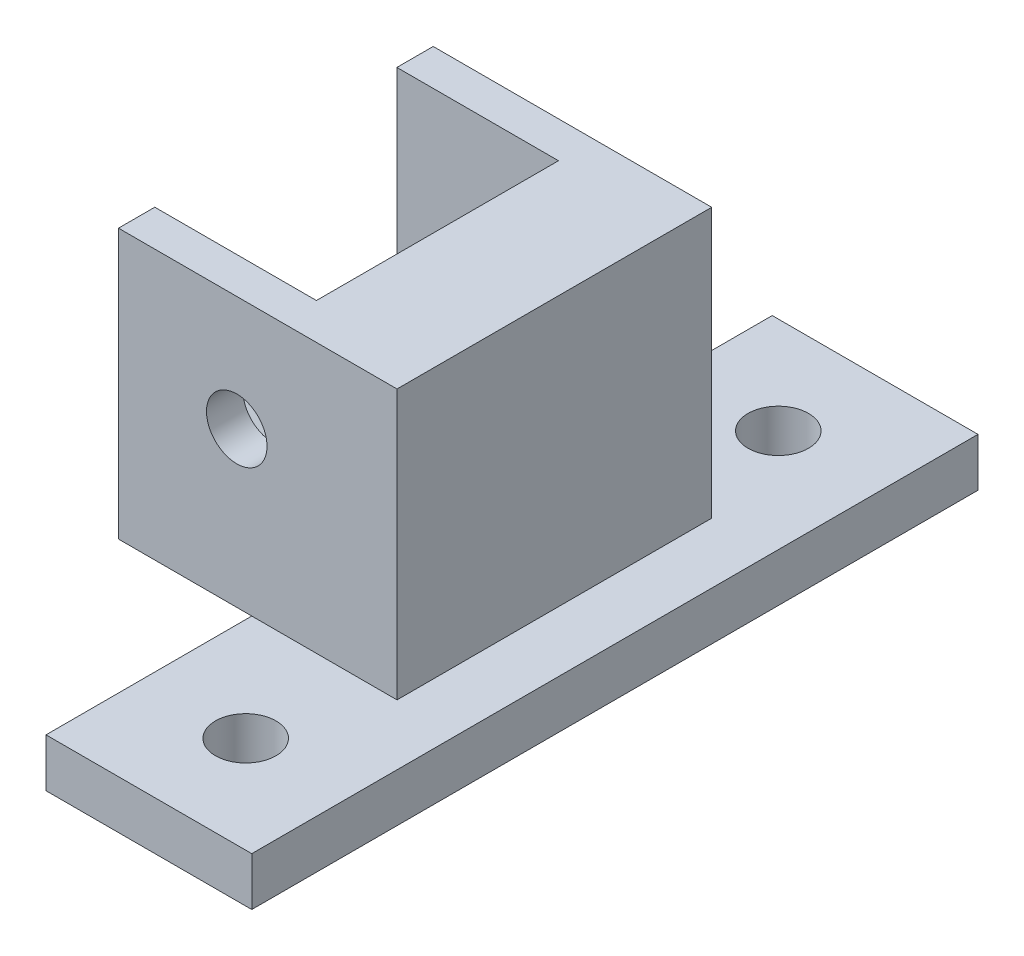
ISO-10303-21;
HEADER;
FILE_DESCRIPTION(('STEP AP214'),'2;1');
FILE_NAME('part.step','',(''),(''),'','','');
FILE_SCHEMA(('AUTOMOTIVE_DESIGN { 1 0 10303 214 1 1 1 1 }'));
ENDSEC;
DATA;
#1=APPLICATION_CONTEXT('core data for automotive mechanical design processes');
#2=APPLICATION_PROTOCOL_DEFINITION('international standard','automotive_design',2000,#1);
#3=PRODUCT_CONTEXT('',#1,'mechanical');
#4=PRODUCT('Part','Part','',(#3));
#5=PRODUCT_RELATED_PRODUCT_CATEGORY('part','',(#4));
#6=PRODUCT_DEFINITION_FORMATION('','',#4);
#7=PRODUCT_DEFINITION_CONTEXT('part definition',#1,'design');
#8=PRODUCT_DEFINITION('design','',#6,#7);
#9=PRODUCT_DEFINITION_SHAPE('','',#8);
#10=(LENGTH_UNIT() NAMED_UNIT(*) SI_UNIT(.MILLI.,.METRE.));
#11=(NAMED_UNIT(*) PLANE_ANGLE_UNIT() SI_UNIT($,.RADIAN.));
#12=(NAMED_UNIT(*) SI_UNIT($,.STERADIAN.) SOLID_ANGLE_UNIT());
#13=UNCERTAINTY_MEASURE_WITH_UNIT(LENGTH_MEASURE(1.E-05),#10,'distance_accuracy_value','');
#14=(GEOMETRIC_REPRESENTATION_CONTEXT(3) GLOBAL_UNCERTAINTY_ASSIGNED_CONTEXT((#13)) GLOBAL_UNIT_ASSIGNED_CONTEXT((#10,
#11,#12)) REPRESENTATION_CONTEXT('',''));
#15=CARTESIAN_POINT('',(0.,0.,0.));
#16=DIRECTION('',(0.,0.,1.));
#17=DIRECTION('',(1.,0.,0.));
#18=AXIS2_PLACEMENT_3D('',#15,#16,#17);
#19=CARTESIAN_POINT('',(0.,323.779975182462,-29.21));
#20=DIRECTION('',(0.,-1.,0.));
#21=DIRECTION('',(0.,0.,-1.));
#22=AXIS2_PLACEMENT_3D('',#19,#20,#21);
#23=PLANE('',#22);
#24=DIRECTION('',(1.,0.,0.));
#25=VECTOR('',#24,1.);
#26=CARTESIAN_POINT('',(0.,323.779975182462,-29.21));
#27=LINE('',#26,#25);
#28=CARTESIAN_POINT('',(497.23394626751,323.779975182462,-29.21));
#29=VERTEX_POINT('',#28);
#30=CARTESIAN_POINT('',(511.217560082314,323.779975182462,-29.21));
#31=VERTEX_POINT('',#30);
#32=EDGE_CURVE('E162',#29,#31,#27,.T.);
#33=ORIENTED_EDGE('',*,*,#32,.T.);
#34=DIRECTION('',(0.,0.,1.));
#35=VECTOR('',#34,1.);
#36=CARTESIAN_POINT('',(511.217560082314,323.779975182462,-50.8));
#37=LINE('',#36,#35);
#38=CARTESIAN_POINT('',(511.217560082314,323.779975182462,3.81));
#39=VERTEX_POINT('',#38);
#40=EDGE_CURVE('E12',#31,#39,#37,.T.);
#41=ORIENTED_EDGE('',*,*,#40,.T.);
#42=DIRECTION('',(-1.,0.,0.));
#43=VECTOR('',#42,1.);
#44=CARTESIAN_POINT('',(526.457560082314,323.779975182462,3.81));
#45=LINE('',#44,#43);
#46=CARTESIAN_POINT('',(497.23394626751,323.779975182462,3.81));
#47=VERTEX_POINT('',#46);
#48=EDGE_CURVE('E224',#39,#47,#45,.T.);
#49=ORIENTED_EDGE('',*,*,#48,.T.);
#50=DIRECTION('',(0.,0.,1.));
#51=VECTOR('',#50,1.);
#52=CARTESIAN_POINT('',(497.23394626751,323.779975182462,-29.21));
#53=LINE('',#52,#51);
#54=EDGE_CURVE('E194',#29,#47,#53,.T.);
#55=ORIENTED_EDGE('',*,*,#54,.F.);
#56=EDGE_LOOP('',(#33,#41,#49,#55));
#57=FACE_BOUND('',#56,.T.);
#58=ADVANCED_FACE('F62',(#57),#23,.T.);
#59=CARTESIAN_POINT('',(509.64503003972,340.,-29.21));
#60=DIRECTION('',(0.,0.,1.));
#61=DIRECTION('',(1.,0.,0.));
#62=AXIS2_PLACEMENT_3D('',#59,#60,#61);
#63=CYLINDRICAL_SURFACE('',#62,12.7);
#64=DIRECTION('',(0.,0.,1.));
#65=VECTOR('',#64,1.);
#66=CARTESIAN_POINT('',(515.974168529679,351.010540675867,-29.21));
#67=LINE('',#66,#65);
#68=CARTESIAN_POINT('',(515.974168529679,351.010540675867,-25.3999999999999));
#69=VERTEX_POINT('',#68);
#70=CARTESIAN_POINT('',(515.974168529679,351.010540675867,0.));
#71=VERTEX_POINT('',#70);
#72=EDGE_CURVE('E72',#69,#71,#67,.T.);
#73=ORIENTED_EDGE('',*,*,#72,.F.);
#74=CARTESIAN_POINT('',(509.64503003972,340.,-25.3999999999999));
#75=DIRECTION('',(0.,0.,-1.));
#76=DIRECTION('',(1.,0.,0.));
#77=AXIS2_PLACEMENT_3D('',#74,#75,#76);
#78=CIRCLE('',#77,12.6999999999999);
#79=CARTESIAN_POINT('',(503.315891549762,328.989459324133,-25.3999999999999));
#80=VERTEX_POINT('',#79);
#81=EDGE_CURVE('E207',#69,#80,#78,.T.);
#82=ORIENTED_EDGE('',*,*,#81,.T.);
#83=DIRECTION('',(0.,0.,1.));
#84=VECTOR('',#83,1.);
#85=CARTESIAN_POINT('',(503.315891549762,328.989459324133,-29.21));
#86=LINE('',#85,#84);
#87=CARTESIAN_POINT('',(503.315891549762,328.989459324133,0.));
#88=VERTEX_POINT('',#87);
#89=EDGE_CURVE('E66',#80,#88,#86,.T.);
#90=ORIENTED_EDGE('',*,*,#89,.T.);
#91=CARTESIAN_POINT('',(509.64503003972,340.,0.));
#92=DIRECTION('',(0.,0.,1.));
#93=DIRECTION('',(1.,0.,0.));
#94=AXIS2_PLACEMENT_3D('',#91,#92,#93);
#95=CIRCLE('',#94,12.7);
#96=EDGE_CURVE('E146',#88,#71,#95,.T.);
#97=ORIENTED_EDGE('',*,*,#96,.T.);
#98=EDGE_LOOP('',(#73,#82,#90,#97));
#99=FACE_BOUND('',#98,.T.);
#100=ADVANCED_FACE('F64',(#99),#63,.F.);
#101=CARTESIAN_POINT('',(279.805597512719,486.766234873348,-29.21));
#102=DIRECTION('',(0.498357361414059,0.866971706761194,0.));
#103=DIRECTION('',(-0.866971706761194,0.498357361414059,0.));
#104=AXIS2_PLACEMENT_3D('',#101,#102,#103);
#105=PLANE('',#104);
#106=DIRECTION('',(0.,0.,1.));
#107=VECTOR('',#106,1.);
#108=CARTESIAN_POINT('',(514.192184349642,352.034870451705,-29.21));
#109=LINE('',#108,#107);
#110=CARTESIAN_POINT('',(514.192184349642,352.034870451705,-25.3999999999999));
#111=VERTEX_POINT('',#110);
#112=CARTESIAN_POINT('',(514.192184349642,352.034870451705,0.));
#113=VERTEX_POINT('',#112);
#114=EDGE_CURVE('E185',#111,#113,#109,.T.);
#115=ORIENTED_EDGE('',*,*,#114,.F.);
#116=DIRECTION('',(0.866971706761216,-0.49835736141402,0.));
#117=VECTOR('',#116,1.);
#118=CARTESIAN_POINT('',(515.974168529679,351.010540675867,-25.3999999999999));
#119=LINE('',#118,#117);
#120=EDGE_CURVE('E151',#111,#69,#119,.T.);
#121=ORIENTED_EDGE('',*,*,#120,.T.);
#122=ORIENTED_EDGE('',*,*,#72,.T.);
#123=DIRECTION('',(-0.866971706761194,0.498357361414059,0.));
#124=VECTOR('',#123,1.);
#125=CARTESIAN_POINT('',(279.805597512719,486.766234873348,0.));
#126=LINE('',#125,#124);
#127=EDGE_CURVE('E161',#71,#113,#126,.T.);
#128=ORIENTED_EDGE('',*,*,#127,.T.);
#129=EDGE_LOOP('',(#115,#121,#122,#128));
#130=FACE_BOUND('',#129,.T.);
#131=ADVANCED_FACE('F248',(#130),#105,.F.);
#132=CARTESIAN_POINT('',(0.,352.034870451705,-29.21));
#133=DIRECTION('',(0.,1.,0.));
#134=DIRECTION('',(0.,0.,1.));
#135=AXIS2_PLACEMENT_3D('',#132,#133,#134);
#136=PLANE('',#135);
#137=ORIENTED_EDGE('',*,*,#114,.T.);
#138=DIRECTION('',(1.,0.,0.));
#139=VECTOR('',#138,1.);
#140=CARTESIAN_POINT('',(497.23394626751,352.034870451705,0.));
#141=LINE('',#140,#139);
#142=CARTESIAN_POINT('',(497.23394626751,352.034870451705,0.));
#143=VERTEX_POINT('',#142);
#144=EDGE_CURVE('E102',#143,#113,#141,.T.);
#145=ORIENTED_EDGE('',*,*,#144,.F.);
#146=DIRECTION('',(0.,0.,-1.));
#147=VECTOR('',#146,1.);
#148=CARTESIAN_POINT('',(497.23394626751,352.034870451705,3.81));
#149=LINE('',#148,#147);
#150=CARTESIAN_POINT('',(497.23394626751,352.034870451705,3.81));
#151=VERTEX_POINT('',#150);
#152=EDGE_CURVE('E218',#151,#143,#149,.T.);
#153=ORIENTED_EDGE('',*,*,#152,.F.);
#154=DIRECTION('',(1.,0.,0.));
#155=VECTOR('',#154,1.);
#156=CARTESIAN_POINT('',(497.23394626751,352.034870451705,3.81));
#157=LINE('',#156,#155);
#158=CARTESIAN_POINT('',(526.457560082314,352.034870451705,3.81));
#159=VERTEX_POINT('',#158);
#160=EDGE_CURVE('E352',#151,#159,#157,.T.);
#161=ORIENTED_EDGE('',*,*,#160,.T.);
#162=DIRECTION('',(0.,0.,1.));
#163=VECTOR('',#162,1.);
#164=CARTESIAN_POINT('',(526.457560082314,352.034870451705,-29.21));
#165=LINE('',#164,#163);
#166=CARTESIAN_POINT('',(526.457560082314,352.034870451705,-29.21));
#167=VERTEX_POINT('',#166);
#168=EDGE_CURVE('E90',#167,#159,#165,.T.);
#169=ORIENTED_EDGE('',*,*,#168,.F.);
#170=DIRECTION('',(-1.,0.,0.));
#171=VECTOR('',#170,1.);
#172=CARTESIAN_POINT('',(0.,352.034870451705,-29.21));
#173=LINE('',#172,#171);
#174=CARTESIAN_POINT('',(497.23394626751,352.034870451705,-29.2099999999999));
#175=VERTEX_POINT('',#174);
#176=EDGE_CURVE('E107',#167,#175,#173,.T.);
#177=ORIENTED_EDGE('',*,*,#176,.T.);
#178=DIRECTION('',(0.,0.,1.));
#179=VECTOR('',#178,1.);
#180=CARTESIAN_POINT('',(497.23394626751,352.034870451705,-29.2099999999999));
#181=LINE('',#180,#179);
#182=CARTESIAN_POINT('',(497.23394626751,352.034870451705,-25.3999999999999));
#183=VERTEX_POINT('',#182);
#184=EDGE_CURVE('E132',#175,#183,#181,.T.);
#185=ORIENTED_EDGE('',*,*,#184,.T.);
#186=DIRECTION('',(1.,0.,0.));
#187=VECTOR('',#186,1.);
#188=CARTESIAN_POINT('',(514.192184349642,352.034870451705,-25.3999999999999));
#189=LINE('',#188,#187);
#190=EDGE_CURVE('E140',#183,#111,#189,.T.);
#191=ORIENTED_EDGE('',*,*,#190,.T.);
#192=EDGE_LOOP('',(#137,#145,#153,#161,#169,#177,#185,#191));
#193=FACE_BOUND('',#192,.T.);
#194=ADVANCED_FACE('F143',(#193),#136,.T.);
#195=CARTESIAN_POINT('',(526.457560082314,0.,-29.21));
#196=DIRECTION('',(1.,0.,0.));
#197=DIRECTION('',(0.,0.,-1.));
#198=AXIS2_PLACEMENT_3D('',#195,#196,#197);
#199=PLANE('',#198);
#200=ORIENTED_EDGE('',*,*,#168,.T.);
#201=DIRECTION('',(0.,-1.,0.));
#202=VECTOR('',#201,1.);
#203=CARTESIAN_POINT('',(526.457560082314,352.034870451705,3.81));
#204=LINE('',#203,#202);
#205=CARTESIAN_POINT('',(526.457560082314,323.779975182462,3.81));
#206=VERTEX_POINT('',#205);
#207=EDGE_CURVE('E230',#159,#206,#204,.T.);
#208=ORIENTED_EDGE('',*,*,#207,.T.);
#209=DIRECTION('',(0.,0.,1.));
#210=VECTOR('',#209,1.);
#211=CARTESIAN_POINT('',(526.457560082314,323.779975182462,-29.21));
#212=LINE('',#211,#210);
#213=CARTESIAN_POINT('',(526.457560082314,323.779975182462,-29.21));
#214=VERTEX_POINT('',#213);
#215=EDGE_CURVE('E190',#214,#206,#212,.T.);
#216=ORIENTED_EDGE('',*,*,#215,.F.);
#217=DIRECTION('',(0.,1.,0.));
#218=VECTOR('',#217,1.);
#219=CARTESIAN_POINT('',(526.457560082314,0.,-29.21));
#220=LINE('',#219,#218);
#221=EDGE_CURVE('E166',#214,#167,#220,.T.);
#222=ORIENTED_EDGE('',*,*,#221,.T.);
#223=EDGE_LOOP('',(#200,#208,#216,#222));
#224=FACE_BOUND('',#223,.T.);
#225=ADVANCED_FACE('F359',(#224),#199,.T.);
#226=CARTESIAN_POINT('',(497.233946267508,-1.95378737210305E-12,-29.21));
#227=DIRECTION('',(-1.,0.,0.));
#228=DIRECTION('',(0.,-1.,0.));
#229=AXIS2_PLACEMENT_3D('',#226,#227,#228);
#230=PLANE('',#229);
#231=ORIENTED_EDGE('',*,*,#54,.T.);
#232=DIRECTION('',(0.,1.,0.));
#233=VECTOR('',#232,1.);
#234=CARTESIAN_POINT('',(497.23394626751,323.779975182462,3.81));
#235=LINE('',#234,#233);
#236=EDGE_CURVE('E350',#47,#151,#235,.T.);
#237=ORIENTED_EDGE('',*,*,#236,.T.);
#238=ORIENTED_EDGE('',*,*,#152,.T.);
#239=DIRECTION('',(0.,1.,0.));
#240=VECTOR('',#239,1.);
#241=CARTESIAN_POINT('',(497.23394626751,323.779975182462,0.));
#242=LINE('',#241,#240);
#243=CARTESIAN_POINT('',(497.23394626751,332.485515976836,0.));
#244=VERTEX_POINT('',#243);
#245=EDGE_CURVE('E212',#244,#143,#242,.T.);
#246=ORIENTED_EDGE('',*,*,#245,.F.);
#247=DIRECTION('',(0.,0.,1.));
#248=VECTOR('',#247,1.);
#249=CARTESIAN_POINT('',(497.23394626751,332.485515976836,-29.21));
#250=LINE('',#249,#248);
#251=CARTESIAN_POINT('',(497.23394626751,332.485515976836,-25.3999999999999));
#252=VERTEX_POINT('',#251);
#253=EDGE_CURVE('E135',#252,#244,#250,.T.);
#254=ORIENTED_EDGE('',*,*,#253,.F.);
#255=DIRECTION('',(0.,1.,0.));
#256=VECTOR('',#255,1.);
#257=CARTESIAN_POINT('',(497.23394626751,352.034870451705,-25.3999999999999));
#258=LINE('',#257,#256);
#259=EDGE_CURVE('E128',#252,#183,#258,.T.);
#260=ORIENTED_EDGE('',*,*,#259,.T.);
#261=ORIENTED_EDGE('',*,*,#184,.F.);
#262=DIRECTION('',(0.,-1.,0.));
#263=VECTOR('',#262,1.);
#264=CARTESIAN_POINT('',(497.233946267508,-1.95378737210305E-12,-29.21));
#265=LINE('',#264,#263);
#266=EDGE_CURVE('E157',#175,#29,#265,.T.);
#267=ORIENTED_EDGE('',*,*,#266,.T.);
#268=EDGE_LOOP('',(#231,#237,#238,#246,#254,#260,#261,#267));
#269=FACE_BOUND('',#268,.T.);
#270=ADVANCED_FACE('F130',(#269),#230,.T.);
#271=CARTESIAN_POINT('',(267.147320532804,464.745153521614,-29.21));
#272=DIRECTION('',(-0.498357361414062,-0.866971706761192,0.));
#273=DIRECTION('',(0.866971706761192,-0.498357361414062,0.));
#274=AXIS2_PLACEMENT_3D('',#271,#272,#273);
#275=PLANE('',#274);
#276=ORIENTED_EDGE('',*,*,#89,.F.);
#277=DIRECTION('',(-0.866971706761192,0.498357361414061,0.));
#278=VECTOR('',#277,1.);
#279=CARTESIAN_POINT('',(497.23394626751,332.485515976836,-25.3999999999999));
#280=LINE('',#279,#278);
#281=EDGE_CURVE('E141',#80,#252,#280,.T.);
#282=ORIENTED_EDGE('',*,*,#281,.T.);
#283=ORIENTED_EDGE('',*,*,#253,.T.);
#284=DIRECTION('',(0.866971706761192,-0.498357361414062,0.));
#285=VECTOR('',#284,1.);
#286=CARTESIAN_POINT('',(267.147320532804,464.745153521614,0.));
#287=LINE('',#286,#285);
#288=EDGE_CURVE('E175',#244,#88,#287,.T.);
#289=ORIENTED_EDGE('',*,*,#288,.T.);
#290=EDGE_LOOP('',(#276,#282,#283,#289));
#291=FACE_BOUND('',#290,.T.);
#292=ADVANCED_FACE('F209',(#291),#275,.F.);
#293=CARTESIAN_POINT('',(0.,0.,-29.21));
#294=DIRECTION('',(0.,0.,1.));
#295=DIRECTION('',(1.,0.,0.));
#296=AXIS2_PLACEMENT_3D('',#293,#294,#295);
#297=PLANE('',#296);
#298=ORIENTED_EDGE('',*,*,#266,.F.);
#299=ORIENTED_EDGE('',*,*,#176,.F.);
#300=ORIENTED_EDGE('',*,*,#221,.F.);
#301=EDGE_CURVE('E160',#31,#214,#27,.T.);
#302=ORIENTED_EDGE('',*,*,#301,.F.);
#303=ORIENTED_EDGE('',*,*,#32,.F.);
#304=EDGE_LOOP('',(#298,#299,#300,#302,#303));
#305=FACE_BOUND('',#304,.T.);
#306=CARTESIAN_POINT('',(509.64503003972,340.,-29.2099999999999));
#307=DIRECTION('',(0.,0.,-1.));
#308=DIRECTION('',(-1.,0.,0.));
#309=AXIS2_PLACEMENT_3D('',#306,#307,#308);
#310=CIRCLE('',#309,3.1750000000002);
#311=CARTESIAN_POINT('',(512.82003003972,340.,-29.2099999999999));
#312=VERTEX_POINT('',#311);
#313=EDGE_CURVE('E236',#312,#312,#310,.T.);
#314=ORIENTED_EDGE('',*,*,#313,.F.);
#315=EDGE_LOOP('',(#314));
#316=FACE_BOUND('',#315,.T.);
#317=ADVANCED_FACE('F374',(#305,#316),#297,.F.);
#318=CARTESIAN_POINT('',(509.64503003972,340.,-25.3999999999999));
#319=DIRECTION('',(0.,0.,1.));
#320=DIRECTION('',(1.,0.,0.));
#321=AXIS2_PLACEMENT_3D('',#318,#319,#320);
#322=PLANE('',#321);
#323=ORIENTED_EDGE('',*,*,#120,.F.);
#324=ORIENTED_EDGE('',*,*,#190,.F.);
#325=ORIENTED_EDGE('',*,*,#259,.F.);
#326=ORIENTED_EDGE('',*,*,#281,.F.);
#327=ORIENTED_EDGE('',*,*,#81,.F.);
#328=EDGE_LOOP('',(#323,#324,#325,#326,#327));
#329=FACE_BOUND('',#328,.T.);
#330=CARTESIAN_POINT('',(509.64503003972,340.,-25.3999999999999));
#331=DIRECTION('',(0.,0.,-1.));
#332=DIRECTION('',(-1.,0.,0.));
#333=AXIS2_PLACEMENT_3D('',#330,#331,#332);
#334=CIRCLE('',#333,3.1750000000002);
#335=CARTESIAN_POINT('',(512.82003003972,340.,-25.3999999999999));
#336=VERTEX_POINT('',#335);
#337=EDGE_CURVE('E235',#336,#336,#334,.T.);
#338=ORIENTED_EDGE('',*,*,#337,.T.);
#339=EDGE_LOOP('',(#338));
#340=FACE_BOUND('',#339,.T.);
#341=ADVANCED_FACE('F148',(#329,#340),#322,.T.);
#342=CARTESIAN_POINT('',(509.64503003972,340.,-29.2099999999999));
#343=DIRECTION('',(0.,0.,1.));
#344=DIRECTION('',(1.,0.,0.));
#345=AXIS2_PLACEMENT_3D('',#342,#343,#344);
#346=CYLINDRICAL_SURFACE('',#345,3.1750000000002);
#347=CARTESIAN_POINT('',(512.82003003972,340.,-29.2099999999999));
#348=CARTESIAN_POINT('',(512.82003003972,340.,-29.1703124999999));
#349=CARTESIAN_POINT('',(512.82003003972,340.,-29.1306249999999));
#350=CARTESIAN_POINT('',(512.82003003972,340.,-29.0512499999999));
#351=CARTESIAN_POINT('',(512.82003003972,340.,-29.0115624999999));
#352=CARTESIAN_POINT('',(512.82003003972,340.,-28.9321874999999));
#353=CARTESIAN_POINT('',(512.82003003972,340.,-28.8924999999999));
#354=CARTESIAN_POINT('',(512.82003003972,340.,-28.8131249999999));
#355=CARTESIAN_POINT('',(512.82003003972,340.,-28.7734374999999));
#356=CARTESIAN_POINT('',(512.82003003972,340.,-28.6940624999999));
#357=CARTESIAN_POINT('',(512.82003003972,340.,-28.6543749999999));
#358=CARTESIAN_POINT('',(512.82003003972,340.,-28.5749999999999));
#359=CARTESIAN_POINT('',(512.82003003972,340.,-28.5353124999999));
#360=CARTESIAN_POINT('',(512.82003003972,340.,-28.4559374999999));
#361=CARTESIAN_POINT('',(512.82003003972,340.,-28.4162499999999));
#362=CARTESIAN_POINT('',(512.82003003972,340.,-28.3368749999999));
#363=CARTESIAN_POINT('',(512.82003003972,340.,-28.2971874999999));
#364=CARTESIAN_POINT('',(512.82003003972,340.,-28.2178124999999));
#365=CARTESIAN_POINT('',(512.82003003972,340.,-28.1781249999999));
#366=CARTESIAN_POINT('',(512.82003003972,340.,-28.0987499999999));
#367=CARTESIAN_POINT('',(512.82003003972,340.,-28.0590624999999));
#368=CARTESIAN_POINT('',(512.82003003972,340.,-27.9796874999999));
#369=CARTESIAN_POINT('',(512.82003003972,340.,-27.9399999999999));
#370=CARTESIAN_POINT('',(512.82003003972,340.,-27.8606249999999));
#371=CARTESIAN_POINT('',(512.82003003972,340.,-27.8209374999999));
#372=CARTESIAN_POINT('',(512.82003003972,340.,-27.7415624999999));
#373=CARTESIAN_POINT('',(512.82003003972,340.,-27.7018749999999));
#374=CARTESIAN_POINT('',(512.82003003972,340.,-27.6224999999999));
#375=CARTESIAN_POINT('',(512.82003003972,340.,-27.5828124999999));
#376=CARTESIAN_POINT('',(512.82003003972,340.,-27.5034374999999));
#377=CARTESIAN_POINT('',(512.82003003972,340.,-27.4637499999999));
#378=CARTESIAN_POINT('',(512.82003003972,340.,-27.3843749999999));
#379=CARTESIAN_POINT('',(512.82003003972,340.,-27.3446874999999));
#380=CARTESIAN_POINT('',(512.82003003972,340.,-27.2653124999999));
#381=CARTESIAN_POINT('',(512.82003003972,340.,-27.2256249999999));
#382=CARTESIAN_POINT('',(512.82003003972,340.,-27.1462499999999));
#383=CARTESIAN_POINT('',(512.82003003972,340.,-27.1065624999999));
#384=CARTESIAN_POINT('',(512.82003003972,340.,-27.0271874999999));
#385=CARTESIAN_POINT('',(512.82003003972,340.,-26.9874999999999));
#386=CARTESIAN_POINT('',(512.82003003972,340.,-26.9081249999999));
#387=CARTESIAN_POINT('',(512.82003003972,340.,-26.8684374999999));
#388=CARTESIAN_POINT('',(512.82003003972,340.,-26.7890624999999));
#389=CARTESIAN_POINT('',(512.82003003972,340.,-26.7493749999999));
#390=CARTESIAN_POINT('',(512.82003003972,340.,-26.6699999999999));
#391=CARTESIAN_POINT('',(512.82003003972,340.,-26.6303124999999));
#392=CARTESIAN_POINT('',(512.82003003972,340.,-26.5509374999999));
#393=CARTESIAN_POINT('',(512.82003003972,340.,-26.5112499999999));
#394=CARTESIAN_POINT('',(512.82003003972,340.,-26.4318749999999));
#395=CARTESIAN_POINT('',(512.82003003972,340.,-26.3921874999999));
#396=CARTESIAN_POINT('',(512.82003003972,340.,-26.3128124999999));
#397=CARTESIAN_POINT('',(512.82003003972,340.,-26.2731249999999));
#398=CARTESIAN_POINT('',(512.82003003972,340.,-26.1937499999999));
#399=CARTESIAN_POINT('',(512.82003003972,340.,-26.1540624999999));
#400=CARTESIAN_POINT('',(512.82003003972,340.,-26.0746874999999));
#401=CARTESIAN_POINT('',(512.82003003972,340.,-26.0349999999999));
#402=CARTESIAN_POINT('',(512.82003003972,340.,-25.9556249999999));
#403=CARTESIAN_POINT('',(512.82003003972,340.,-25.9159374999999));
#404=CARTESIAN_POINT('',(512.82003003972,340.,-25.8365624999999));
#405=CARTESIAN_POINT('',(512.82003003972,340.,-25.7968749999999));
#406=CARTESIAN_POINT('',(512.82003003972,340.,-25.7174999999999));
#407=CARTESIAN_POINT('',(512.82003003972,340.,-25.6778124999999));
#408=CARTESIAN_POINT('',(512.82003003972,340.,-25.5984374999999));
#409=CARTESIAN_POINT('',(512.82003003972,340.,-25.5587499999999));
#410=CARTESIAN_POINT('',(512.82003003972,340.,-25.4793749999999));
#411=CARTESIAN_POINT('',(512.82003003972,340.,-25.4396874999999));
#412=CARTESIAN_POINT('',(512.82003003972,340.,-25.3999999999999));
#413=B_SPLINE_CURVE_WITH_KNOTS('',3,(#347,#348,#349,#350,#351,#352,#353,#354,#355,#356,#357,
#358,#359,#360,#361,#362,#363,#364,#365,#366,#367,#368,#369,#370,#371,#372,#373,#374,#375,#376,
#377,#378,#379,#380,#381,#382,#383,#384,#385,#386,#387,#388,#389,#390,#391,#392,#393,#394,#395,
#396,#397,#398,#399,#400,#401,#402,#403,#404,#405,#406,#407,#408,#409,#410,#411,#412),
.UNSPECIFIED.,.F.,.F.,(4,2,2,2,2,2,2,2,2,2,2,2,2,2,2,2,2,2,2,2,2,2,2,2,2,2,2,2,2,2,2,2,4),(0.,
0.119062500000003,0.238125000000002,0.357187500000002,0.476250000000001,0.5953125,
0.714375000000003,0.833437500000003,0.952500000000002,1.0715625,1.190625,1.3096875,1.42875,
1.5478125,1.666875,1.7859375,1.905,2.0240625,2.143125,2.2621875,2.38125,2.5003125,2.619375,
2.7384375,2.8575,2.9765625,3.095625,3.2146875,3.33375,3.4528125,3.571875,3.6909375,3.81),.UNSPECIFIED.);
#414=EDGE_CURVE('BSEAM381',#312,#336,#413,.T.);
#415=ORIENTED_EDGE('',*,*,#313,.T.);
#416=ORIENTED_EDGE('',*,*,#337,.F.);
#417=ORIENTED_EDGE('',*,*,#414,.T.);
#418=ORIENTED_EDGE('',*,*,#414,.F.);
#419=EDGE_LOOP('',(#415,#417,#416,#418));
#420=FACE_BOUND('',#419,.T.);
#421=ADVANCED_FACE('F381',(#420),#346,.F.);
#422=CARTESIAN_POINT('',(0.,0.,0.));
#423=DIRECTION('',(0.,0.,-1.));
#424=DIRECTION('',(-1.,0.,0.));
#425=AXIS2_PLACEMENT_3D('',#422,#423,#424);
#426=PLANE('',#425);
#427=CARTESIAN_POINT('',(509.64503003972,340.,0.));
#428=DIRECTION('',(0.,0.,1.));
#429=DIRECTION('',(1.,0.,0.));
#430=AXIS2_PLACEMENT_3D('',#427,#428,#429);
#431=CIRCLE('',#430,3.1750000000002);
#432=CARTESIAN_POINT('',(506.47003003972,340.,0.));
#433=VERTEX_POINT('',#432);
#434=EDGE_CURVE('E227',#433,#433,#431,.T.);
#435=ORIENTED_EDGE('',*,*,#434,.T.);
#436=EDGE_LOOP('',(#435));
#437=FACE_BOUND('',#436,.T.);
#438=ORIENTED_EDGE('',*,*,#288,.F.);
#439=ORIENTED_EDGE('',*,*,#245,.T.);
#440=ORIENTED_EDGE('',*,*,#144,.T.);
#441=ORIENTED_EDGE('',*,*,#127,.F.);
#442=ORIENTED_EDGE('',*,*,#96,.F.);
#443=EDGE_LOOP('',(#438,#439,#440,#441,#442));
#444=FACE_BOUND('',#443,.T.);
#445=ADVANCED_FACE('F210',(#437,#444),#426,.T.);
#446=CARTESIAN_POINT('',(0.,0.,3.81));
#447=DIRECTION('',(0.,0.,-1.));
#448=DIRECTION('',(-1.,0.,0.));
#449=AXIS2_PLACEMENT_3D('',#446,#447,#448);
#450=PLANE('',#449);
#451=EDGE_CURVE('E347',#206,#39,#45,.T.);
#452=ORIENTED_EDGE('',*,*,#451,.F.);
#453=ORIENTED_EDGE('',*,*,#207,.F.);
#454=ORIENTED_EDGE('',*,*,#160,.F.);
#455=ORIENTED_EDGE('',*,*,#236,.F.);
#456=ORIENTED_EDGE('',*,*,#48,.F.);
#457=EDGE_LOOP('',(#452,#453,#454,#455,#456));
#458=FACE_BOUND('',#457,.T.);
#459=CARTESIAN_POINT('',(509.64503003972,340.,3.81));
#460=DIRECTION('',(0.,0.,1.));
#461=DIRECTION('',(1.,0.,0.));
#462=AXIS2_PLACEMENT_3D('',#459,#460,#461);
#463=CIRCLE('',#462,3.1750000000002);
#464=CARTESIAN_POINT('',(506.47003003972,340.,3.81));
#465=VERTEX_POINT('',#464);
#466=EDGE_CURVE('E220',#465,#465,#463,.T.);
#467=ORIENTED_EDGE('',*,*,#466,.F.);
#468=EDGE_LOOP('',(#467));
#469=FACE_BOUND('',#468,.T.);
#470=ADVANCED_FACE('F363',(#458,#469),#450,.F.);
#471=CARTESIAN_POINT('',(509.64503003972,340.,3.81));
#472=DIRECTION('',(0.,0.,-1.));
#473=DIRECTION('',(-1.,0.,0.));
#474=AXIS2_PLACEMENT_3D('',#471,#472,#473);
#475=CYLINDRICAL_SURFACE('',#474,3.1750000000002);
#476=CARTESIAN_POINT('',(506.47003003972,340.,3.81));
#477=CARTESIAN_POINT('',(506.47003003972,340.,3.7703125));
#478=CARTESIAN_POINT('',(506.47003003972,340.,3.730625));
#479=CARTESIAN_POINT('',(506.47003003972,340.,3.65125));
#480=CARTESIAN_POINT('',(506.47003003972,340.,3.6115625));
#481=CARTESIAN_POINT('',(506.47003003972,340.,3.5321875));
#482=CARTESIAN_POINT('',(506.47003003972,340.,3.4925));
#483=CARTESIAN_POINT('',(506.47003003972,340.,3.413125));
#484=CARTESIAN_POINT('',(506.47003003972,340.,3.3734375));
#485=CARTESIAN_POINT('',(506.47003003972,340.,3.2940625));
#486=CARTESIAN_POINT('',(506.47003003972,340.,3.254375));
#487=CARTESIAN_POINT('',(506.47003003972,340.,3.175));
#488=CARTESIAN_POINT('',(506.47003003972,340.,3.1353125));
#489=CARTESIAN_POINT('',(506.47003003972,340.,3.0559375));
#490=CARTESIAN_POINT('',(506.47003003972,340.,3.01625));
#491=CARTESIAN_POINT('',(506.47003003972,340.,2.936875));
#492=CARTESIAN_POINT('',(506.47003003972,340.,2.8971875));
#493=CARTESIAN_POINT('',(506.47003003972,340.,2.8178125));
#494=CARTESIAN_POINT('',(506.47003003972,340.,2.778125));
#495=CARTESIAN_POINT('',(506.47003003972,340.,2.69875));
#496=CARTESIAN_POINT('',(506.47003003972,340.,2.6590625));
#497=CARTESIAN_POINT('',(506.47003003972,340.,2.5796875));
#498=CARTESIAN_POINT('',(506.47003003972,340.,2.54));
#499=CARTESIAN_POINT('',(506.47003003972,340.,2.460625));
#500=CARTESIAN_POINT('',(506.47003003972,340.,2.4209375));
#501=CARTESIAN_POINT('',(506.47003003972,340.,2.3415625));
#502=CARTESIAN_POINT('',(506.47003003972,340.,2.301875));
#503=CARTESIAN_POINT('',(506.47003003972,340.,2.2225));
#504=CARTESIAN_POINT('',(506.47003003972,340.,2.1828125));
#505=CARTESIAN_POINT('',(506.47003003972,340.,2.1034375));
#506=CARTESIAN_POINT('',(506.47003003972,340.,2.06375));
#507=CARTESIAN_POINT('',(506.47003003972,340.,1.984375));
#508=CARTESIAN_POINT('',(506.47003003972,340.,1.9446875));
#509=CARTESIAN_POINT('',(506.47003003972,340.,1.8653125));
#510=CARTESIAN_POINT('',(506.47003003972,340.,1.825625));
#511=CARTESIAN_POINT('',(506.47003003972,340.,1.74625));
#512=CARTESIAN_POINT('',(506.47003003972,340.,1.7065625));
#513=CARTESIAN_POINT('',(506.47003003972,340.,1.6271875));
#514=CARTESIAN_POINT('',(506.47003003972,340.,1.5875));
#515=CARTESIAN_POINT('',(506.47003003972,340.,1.508125));
#516=CARTESIAN_POINT('',(506.47003003972,340.,1.4684375));
#517=CARTESIAN_POINT('',(506.47003003972,340.,1.3890625));
#518=CARTESIAN_POINT('',(506.47003003972,340.,1.349375));
#519=CARTESIAN_POINT('',(506.47003003972,340.,1.27));
#520=CARTESIAN_POINT('',(506.47003003972,340.,1.2303125));
#521=CARTESIAN_POINT('',(506.47003003972,340.,1.1509375));
#522=CARTESIAN_POINT('',(506.47003003972,340.,1.11125));
#523=CARTESIAN_POINT('',(506.47003003972,340.,1.031875));
#524=CARTESIAN_POINT('',(506.47003003972,340.,0.9921875));
#525=CARTESIAN_POINT('',(506.47003003972,340.,0.9128125));
#526=CARTESIAN_POINT('',(506.47003003972,340.,0.873125));
#527=CARTESIAN_POINT('',(506.47003003972,340.,0.79375));
#528=CARTESIAN_POINT('',(506.47003003972,340.,0.7540625));
#529=CARTESIAN_POINT('',(506.47003003972,340.,0.6746875));
#530=CARTESIAN_POINT('',(506.47003003972,340.,0.635));
#531=CARTESIAN_POINT('',(506.47003003972,340.,0.555625));
#532=CARTESIAN_POINT('',(506.47003003972,340.,0.5159375));
#533=CARTESIAN_POINT('',(506.47003003972,340.,0.4365625));
#534=CARTESIAN_POINT('',(506.47003003972,340.,0.396875));
#535=CARTESIAN_POINT('',(506.47003003972,340.,0.3175));
#536=CARTESIAN_POINT('',(506.47003003972,340.,0.2778125));
#537=CARTESIAN_POINT('',(506.47003003972,340.,0.1984375));
#538=CARTESIAN_POINT('',(506.47003003972,340.,0.15875));
#539=CARTESIAN_POINT('',(506.47003003972,340.,0.0793749999999999));
#540=CARTESIAN_POINT('',(506.47003003972,340.,0.0396874999999999));
#541=CARTESIAN_POINT('',(506.47003003972,340.,0.));
#542=B_SPLINE_CURVE_WITH_KNOTS('',3,(#476,#477,#478,#479,#480,#481,#482,#483,#484,#485,#486,
#487,#488,#489,#490,#491,#492,#493,#494,#495,#496,#497,#498,#499,#500,#501,#502,#503,#504,#505,
#506,#507,#508,#509,#510,#511,#512,#513,#514,#515,#516,#517,#518,#519,#520,#521,#522,#523,#524,
#525,#526,#527,#528,#529,#530,#531,#532,#533,#534,#535,#536,#537,#538,#539,#540,#541),
.UNSPECIFIED.,.F.,.F.,(4,2,2,2,2,2,2,2,2,2,2,2,2,2,2,2,2,2,2,2,2,2,2,2,2,2,2,2,2,2,2,2,4),(0.,
0.1190625,0.238125,0.3571875,0.47625,0.595312499999999,0.714375,0.833437499999999,
0.952499999999999,1.0715625,1.190625,1.3096875,1.42875,1.5478125,1.666875,1.7859375,1.905,
2.0240625,2.143125,2.2621875,2.38125,2.5003125,2.619375,2.7384375,2.8575,2.9765625,3.095625,
3.2146875,3.33375,3.4528125,3.571875,3.6909375,3.81),.UNSPECIFIED.);
#543=EDGE_CURVE('BSEAM420',#465,#433,#542,.T.);
#544=ORIENTED_EDGE('',*,*,#466,.T.);
#545=ORIENTED_EDGE('',*,*,#434,.F.);
#546=ORIENTED_EDGE('',*,*,#543,.T.);
#547=ORIENTED_EDGE('',*,*,#543,.F.);
#548=EDGE_LOOP('',(#544,#546,#545,#547));
#549=FACE_BOUND('',#548,.T.);
#550=ADVANCED_FACE('F420',(#549),#475,.F.);
#551=CARTESIAN_POINT('',(511.217560082314,318.699975182462,-50.8));
#552=DIRECTION('',(-1.,0.,0.));
#553=DIRECTION('',(0.,-1.,0.));
#554=AXIS2_PLACEMENT_3D('',#551,#552,#553);
#555=PLANE('',#554);
#556=CARTESIAN_POINT('',(511.217560082314,323.779975182462,-50.8));
#557=VERTEX_POINT('',#556);
#558=EDGE_CURVE('E74',#557,#31,#37,.T.);
#559=ORIENTED_EDGE('',*,*,#558,.F.);
#560=DIRECTION('',(0.,1.,0.));
#561=VECTOR('',#560,1.);
#562=CARTESIAN_POINT('',(511.217560082314,318.699975182462,-50.8));
#563=LINE('',#562,#561);
#564=CARTESIAN_POINT('',(511.217560082314,318.699975182462,-50.8));
#565=VERTEX_POINT('',#564);
#566=EDGE_CURVE('E314',#565,#557,#563,.T.);
#567=ORIENTED_EDGE('',*,*,#566,.F.);
#568=DIRECTION('',(0.,0.,1.));
#569=VECTOR('',#568,1.);
#570=CARTESIAN_POINT('',(511.217560082314,318.699975182462,-50.8));
#571=LINE('',#570,#569);
#572=CARTESIAN_POINT('',(511.217560082314,318.699975182462,25.4));
#573=VERTEX_POINT('',#572);
#574=EDGE_CURVE('E306',#565,#573,#571,.T.);
#575=ORIENTED_EDGE('',*,*,#574,.T.);
#576=DIRECTION('',(0.,1.,0.));
#577=VECTOR('',#576,1.);
#578=CARTESIAN_POINT('',(511.217560082314,318.699975182462,25.4));
#579=LINE('',#578,#577);
#580=CARTESIAN_POINT('',(511.217560082314,323.779975182462,25.4));
#581=VERTEX_POINT('',#580);
#582=EDGE_CURVE('E290',#573,#581,#579,.T.);
#583=ORIENTED_EDGE('',*,*,#582,.T.);
#584=EDGE_CURVE('E75',#39,#581,#37,.T.);
#585=ORIENTED_EDGE('',*,*,#584,.F.);
#586=ORIENTED_EDGE('',*,*,#40,.F.);
#587=EDGE_LOOP('',(#559,#567,#575,#583,#585,#586));
#588=FACE_BOUND('',#587,.T.);
#589=ADVANCED_FACE('F313',(#588),#555,.T.);
#590=CARTESIAN_POINT('',(511.217560082314,318.699975182462,-50.8));
#591=DIRECTION('',(0.,0.,-1.));
#592=DIRECTION('',(0.,1.,0.));
#593=AXIS2_PLACEMENT_3D('',#590,#591,#592);
#594=PLANE('',#593);
#595=DIRECTION('',(-1.,0.,0.));
#596=VECTOR('',#595,1.);
#597=CARTESIAN_POINT('',(511.217560082314,323.779975182462,-50.8));
#598=LINE('',#597,#596);
#599=CARTESIAN_POINT('',(532.807560082314,323.779975182462,-50.8));
#600=VERTEX_POINT('',#599);
#601=EDGE_CURVE('E316',#600,#557,#598,.T.);
#602=ORIENTED_EDGE('',*,*,#601,.F.);
#603=DIRECTION('',(0.,1.,0.));
#604=VECTOR('',#603,1.);
#605=CARTESIAN_POINT('',(532.807560082314,318.699975182462,-50.8));
#606=LINE('',#605,#604);
#607=CARTESIAN_POINT('',(532.807560082314,318.699975182462,-50.8));
#608=VERTEX_POINT('',#607);
#609=EDGE_CURVE('E339',#608,#600,#606,.T.);
#610=ORIENTED_EDGE('',*,*,#609,.F.);
#611=DIRECTION('',(-1.,0.,0.));
#612=VECTOR('',#611,1.);
#613=CARTESIAN_POINT('',(511.217560082314,318.699975182462,-50.8));
#614=LINE('',#613,#612);
#615=EDGE_CURVE('E299',#608,#565,#614,.T.);
#616=ORIENTED_EDGE('',*,*,#615,.T.);
#617=ORIENTED_EDGE('',*,*,#566,.T.);
#618=EDGE_LOOP('',(#602,#610,#616,#617));
#619=FACE_BOUND('',#618,.T.);
#620=ADVANCED_FACE('F446',(#619),#594,.T.);
#621=CARTESIAN_POINT('',(532.807560082314,318.699975182462,-50.8));
#622=DIRECTION('',(1.,0.,0.));
#623=DIRECTION('',(0.,1.,0.));
#624=AXIS2_PLACEMENT_3D('',#621,#622,#623);
#625=PLANE('',#624);
#626=DIRECTION('',(0.,0.,-1.));
#627=VECTOR('',#626,1.);
#628=CARTESIAN_POINT('',(532.807560082314,323.779975182462,-50.8));
#629=LINE('',#628,#627);
#630=CARTESIAN_POINT('',(532.807560082314,323.779975182462,25.4));
#631=VERTEX_POINT('',#630);
#632=EDGE_CURVE('E320',#631,#600,#629,.T.);
#633=ORIENTED_EDGE('',*,*,#632,.F.);
#634=DIRECTION('',(0.,1.,0.));
#635=VECTOR('',#634,1.);
#636=CARTESIAN_POINT('',(532.807560082314,318.699975182462,25.4));
#637=LINE('',#636,#635);
#638=CARTESIAN_POINT('',(532.807560082314,318.699975182462,25.4));
#639=VERTEX_POINT('',#638);
#640=EDGE_CURVE('E298',#639,#631,#637,.T.);
#641=ORIENTED_EDGE('',*,*,#640,.F.);
#642=DIRECTION('',(0.,0.,-1.));
#643=VECTOR('',#642,1.);
#644=CARTESIAN_POINT('',(532.807560082314,318.699975182462,-50.8));
#645=LINE('',#644,#643);
#646=EDGE_CURVE('E309',#639,#608,#645,.T.);
#647=ORIENTED_EDGE('',*,*,#646,.T.);
#648=ORIENTED_EDGE('',*,*,#609,.T.);
#649=EDGE_LOOP('',(#633,#641,#647,#648));
#650=FACE_BOUND('',#649,.T.);
#651=ADVANCED_FACE('F455',(#650),#625,.T.);
#652=CARTESIAN_POINT('',(511.217560082314,318.699975182462,25.4));
#653=DIRECTION('',(0.,0.,1.));
#654=DIRECTION('',(0.,-1.,0.));
#655=AXIS2_PLACEMENT_3D('',#652,#653,#654);
#656=PLANE('',#655);
#657=DIRECTION('',(1.,0.,0.));
#658=VECTOR('',#657,1.);
#659=CARTESIAN_POINT('',(511.217560082314,323.779975182462,25.4));
#660=LINE('',#659,#658);
#661=EDGE_CURVE('E295',#581,#631,#660,.T.);
#662=ORIENTED_EDGE('',*,*,#661,.F.);
#663=ORIENTED_EDGE('',*,*,#582,.F.);
#664=DIRECTION('',(1.,0.,0.));
#665=VECTOR('',#664,1.);
#666=CARTESIAN_POINT('',(511.217560082314,318.699975182462,25.4));
#667=LINE('',#666,#665);
#668=EDGE_CURVE('E293',#573,#639,#667,.T.);
#669=ORIENTED_EDGE('',*,*,#668,.T.);
#670=ORIENTED_EDGE('',*,*,#640,.T.);
#671=EDGE_LOOP('',(#662,#663,#669,#670));
#672=FACE_BOUND('',#671,.T.);
#673=ADVANCED_FACE('F292',(#672),#656,.T.);
#674=CARTESIAN_POINT('',(0.,318.699975182462,-2.34607021391388E-13));
#675=DIRECTION('',(0.,1.,0.));
#676=DIRECTION('',(0.,0.,1.));
#677=AXIS2_PLACEMENT_3D('',#674,#675,#676);
#678=PLANE('',#677);
#679=CARTESIAN_POINT('',(522.012560082314,318.699975182462,15.24));
#680=DIRECTION('',(0.,1.,0.));
#681=DIRECTION('',(0.,0.,1.));
#682=AXIS2_PLACEMENT_3D('',#679,#680,#681);
#683=CIRCLE('',#682,3.17500000000008);
#684=CARTESIAN_POINT('',(522.012560082314,318.699975182462,18.4150000000001));
#685=VERTEX_POINT('',#684);
#686=EDGE_CURVE('E606',#685,#685,#683,.T.);
#687=ORIENTED_EDGE('',*,*,#686,.T.);
#688=EDGE_LOOP('',(#687));
#689=FACE_BOUND('',#688,.T.);
#690=CARTESIAN_POINT('',(522.012560082314,318.699975182462,-40.64));
#691=DIRECTION('',(0.,1.,0.));
#692=DIRECTION('',(0.,0.,1.));
#693=AXIS2_PLACEMENT_3D('',#690,#691,#692);
#694=CIRCLE('',#693,3.17500000000008);
#695=CARTESIAN_POINT('',(522.012560082314,318.699975182462,-37.4649999999999));
#696=VERTEX_POINT('',#695);
#697=EDGE_CURVE('E614',#696,#696,#694,.T.);
#698=ORIENTED_EDGE('',*,*,#697,.T.);
#699=EDGE_LOOP('',(#698));
#700=FACE_BOUND('',#699,.T.);
#701=ORIENTED_EDGE('',*,*,#574,.F.);
#702=ORIENTED_EDGE('',*,*,#615,.F.);
#703=ORIENTED_EDGE('',*,*,#646,.F.);
#704=ORIENTED_EDGE('',*,*,#668,.F.);
#705=EDGE_LOOP('',(#701,#702,#703,#704));
#706=FACE_BOUND('',#705,.T.);
#707=ADVANCED_FACE('F304',(#689,#700,#706),#678,.F.);
#708=CARTESIAN_POINT('',(0.,323.779975182462,-2.35871380157566E-13));
#709=DIRECTION('',(0.,1.,0.));
#710=DIRECTION('',(0.,0.,1.));
#711=AXIS2_PLACEMENT_3D('',#708,#709,#710);
#712=PLANE('',#711);
#713=CARTESIAN_POINT('',(522.012560082314,323.779975182462,15.24));
#714=DIRECTION('',(0.,1.,0.));
#715=DIRECTION('',(0.,0.,1.));
#716=AXIS2_PLACEMENT_3D('',#713,#714,#715);
#717=CIRCLE('',#716,3.17500000000008);
#718=CARTESIAN_POINT('',(522.012560082314,323.779975182462,18.4150000000001));
#719=VERTEX_POINT('',#718);
#720=EDGE_CURVE('E609',#719,#719,#717,.T.);
#721=ORIENTED_EDGE('',*,*,#720,.F.);
#722=EDGE_LOOP('',(#721));
#723=FACE_BOUND('',#722,.T.);
#724=CARTESIAN_POINT('',(522.012560082314,323.779975182462,-40.64));
#725=DIRECTION('',(0.,1.,0.));
#726=DIRECTION('',(0.,0.,1.));
#727=AXIS2_PLACEMENT_3D('',#724,#725,#726);
#728=CIRCLE('',#727,3.17500000000008);
#729=CARTESIAN_POINT('',(522.012560082314,323.779975182462,-37.4649999999999));
#730=VERTEX_POINT('',#729);
#731=EDGE_CURVE('E323',#730,#730,#728,.T.);
#732=ORIENTED_EDGE('',*,*,#731,.F.);
#733=EDGE_LOOP('',(#732));
#734=FACE_BOUND('',#733,.T.);
#735=ORIENTED_EDGE('',*,*,#215,.T.);
#736=ORIENTED_EDGE('',*,*,#451,.T.);
#737=ORIENTED_EDGE('',*,*,#584,.T.);
#738=ORIENTED_EDGE('',*,*,#661,.T.);
#739=ORIENTED_EDGE('',*,*,#632,.T.);
#740=ORIENTED_EDGE('',*,*,#601,.T.);
#741=ORIENTED_EDGE('',*,*,#558,.T.);
#742=ORIENTED_EDGE('',*,*,#301,.T.);
#743=EDGE_LOOP('',(#735,#736,#737,#738,#739,#740,#741,#742));
#744=FACE_BOUND('',#743,.T.);
#745=ADVANCED_FACE('F368',(#723,#734,#744),#712,.T.);
#746=CARTESIAN_POINT('',(522.012560082314,318.699975182462,-40.64));
#747=DIRECTION('',(0.,1.,0.));
#748=DIRECTION('',(0.,0.,1.));
#749=AXIS2_PLACEMENT_3D('',#746,#747,#748);
#750=CYLINDRICAL_SURFACE('',#749,3.17500000000008);
#751=ORIENTED_EDGE('',*,*,#697,.F.);
#752=EDGE_LOOP('',(#751));
#753=FACE_BOUND('',#752,.T.);
#754=ORIENTED_EDGE('',*,*,#731,.T.);
#755=EDGE_LOOP('',(#754));
#756=FACE_BOUND('',#755,.T.);
#757=ADVANCED_FACE('F491',(#753,#756),#750,.F.);
#758=CARTESIAN_POINT('',(522.012560082314,318.699975182462,15.24));
#759=DIRECTION('',(0.,1.,0.));
#760=DIRECTION('',(0.,0.,1.));
#761=AXIS2_PLACEMENT_3D('',#758,#759,#760);
#762=CYLINDRICAL_SURFACE('',#761,3.17500000000008);
#763=ORIENTED_EDGE('',*,*,#686,.F.);
#764=EDGE_LOOP('',(#763));
#765=FACE_BOUND('',#764,.T.);
#766=ORIENTED_EDGE('',*,*,#720,.T.);
#767=EDGE_LOOP('',(#766));
#768=FACE_BOUND('',#767,.T.);
#769=ADVANCED_FACE('F501',(#765,#768),#762,.F.);
#770=CLOSED_SHELL('',(#58,#100,#131,#194,#225,#270,#292,#317,#341,#421,#445,#470,#550,#589,#620,
#651,#673,#707,#745,#757,#769));
#771=MANIFOLD_SOLID_BREP('B2',#770);
#772=ADVANCED_BREP_SHAPE_REPRESENTATION('',(#18,#771),#14);
#773=SHAPE_DEFINITION_REPRESENTATION(#9,#772);
ENDSEC;
END-ISO-10303-21;
